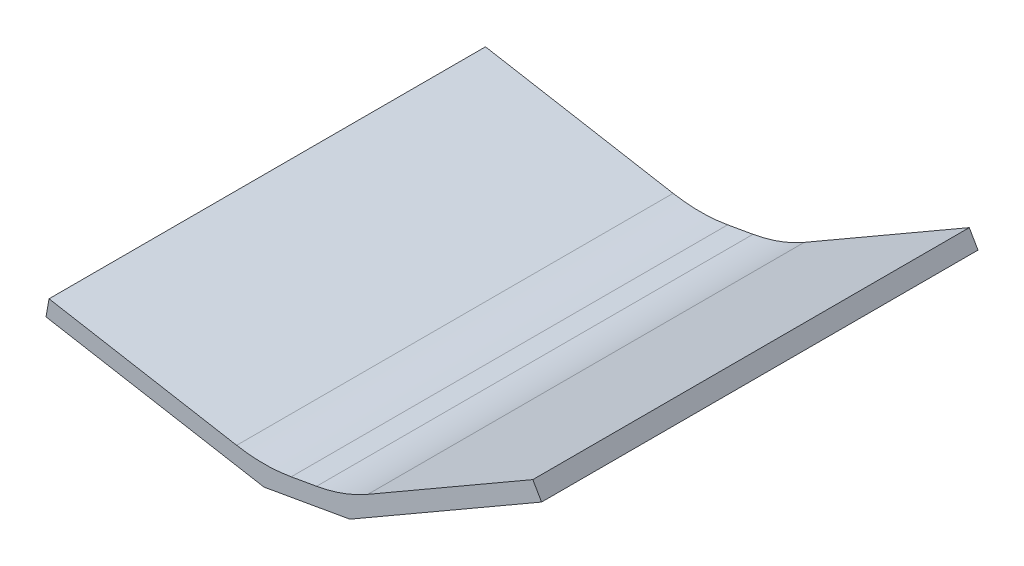
ISO-10303-21;
HEADER;
FILE_DESCRIPTION(('STEP AP214'),'2;1');
FILE_NAME('part.step','',(''),(''),'','','');
FILE_SCHEMA(('AUTOMOTIVE_DESIGN { 1 0 10303 214 1 1 1 1 }'));
ENDSEC;
DATA;
#1=APPLICATION_CONTEXT('core data for automotive mechanical design processes');
#2=APPLICATION_PROTOCOL_DEFINITION('international standard','automotive_design',2000,#1);
#3=PRODUCT_CONTEXT('',#1,'mechanical');
#4=PRODUCT('Part','Part','',(#3));
#5=PRODUCT_RELATED_PRODUCT_CATEGORY('part','',(#4));
#6=PRODUCT_DEFINITION_FORMATION('','',#4);
#7=PRODUCT_DEFINITION_CONTEXT('part definition',#1,'design');
#8=PRODUCT_DEFINITION('design','',#6,#7);
#9=PRODUCT_DEFINITION_SHAPE('','',#8);
#10=(LENGTH_UNIT() NAMED_UNIT(*) SI_UNIT(.MILLI.,.METRE.));
#11=(NAMED_UNIT(*) PLANE_ANGLE_UNIT() SI_UNIT($,.RADIAN.));
#12=(NAMED_UNIT(*) SI_UNIT($,.STERADIAN.) SOLID_ANGLE_UNIT());
#13=UNCERTAINTY_MEASURE_WITH_UNIT(LENGTH_MEASURE(1.E-05),#10,'distance_accuracy_value','');
#14=(GEOMETRIC_REPRESENTATION_CONTEXT(3) GLOBAL_UNCERTAINTY_ASSIGNED_CONTEXT((#13)) GLOBAL_UNIT_ASSIGNED_CONTEXT((#10,
#11,#12)) REPRESENTATION_CONTEXT('',''));
#15=CARTESIAN_POINT('',(0.,0.,0.));
#16=DIRECTION('',(0.,0.,1.));
#17=DIRECTION('',(1.,0.,0.));
#18=AXIS2_PLACEMENT_3D('',#15,#16,#17);
#19=CARTESIAN_POINT('',(-55.0824007371197,2.62066859807962,50.));
#20=DIRECTION('',(-0.173648177666929,-0.984807753012208,0.));
#21=DIRECTION('',(0.984807753012208,-0.173648177666929,0.));
#22=AXIS2_PLACEMENT_3D('',#19,#20,#21);
#23=PLANE('',#22);
#24=DIRECTION('',(-0.984807753012208,0.173648177666929,0.));
#25=VECTOR('',#24,1.);
#26=CARTESIAN_POINT('',(-55.0824007371197,2.62066859807962,50.));
#27=LINE('',#26,#25);
#28=CARTESIAN_POINT('',(-58.2080679351244,3.17180805780327,50.));
#29=VERTEX_POINT('',#28);
#30=CARTESIAN_POINT('',(-79.7025945624249,6.96187303975283,50.));
#31=VERTEX_POINT('',#30);
#32=EDGE_CURVE('E113',#29,#31,#27,.T.);
#33=ORIENTED_EDGE('',*,*,#32,.F.);
#34=DIRECTION('',(0.,0.,-1.));
#35=VECTOR('',#34,1.);
#36=CARTESIAN_POINT('',(-58.2080679351244,3.17180805780327,50.));
#37=LINE('',#36,#35);
#38=CARTESIAN_POINT('',(-58.2080679351244,3.17180805780327,0.));
#39=VERTEX_POINT('',#38);
#40=EDGE_CURVE('E137',#29,#39,#37,.T.);
#41=ORIENTED_EDGE('',*,*,#40,.T.);
#42=DIRECTION('',(-0.984807753012208,0.173648177666929,0.));
#43=VECTOR('',#42,1.);
#44=CARTESIAN_POINT('',(-55.0824007371197,2.62066859807962,0.));
#45=LINE('',#44,#43);
#46=CARTESIAN_POINT('',(-79.7025945624249,6.96187303975283,0.));
#47=VERTEX_POINT('',#46);
#48=EDGE_CURVE('E140',#39,#47,#45,.T.);
#49=ORIENTED_EDGE('',*,*,#48,.T.);
#50=DIRECTION('',(0.,0.,-1.));
#51=VECTOR('',#50,1.);
#52=CARTESIAN_POINT('',(-79.7025945624249,6.96187303975283,50.));
#53=LINE('',#52,#51);
#54=EDGE_CURVE('E128',#31,#47,#53,.T.);
#55=ORIENTED_EDGE('',*,*,#54,.F.);
#56=EDGE_LOOP('',(#33,#41,#49,#55));
#57=FACE_BOUND('',#56,.T.);
#58=ADVANCED_FACE('F39',(#57),#23,.F.);
#59=CARTESIAN_POINT('',(-79.7025945624249,6.96187303975283,50.));
#60=DIRECTION('',(0.984807753012207,-0.173648177666935,0.));
#61=DIRECTION('',(0.173648177666935,0.984807753012207,0.));
#62=AXIS2_PLACEMENT_3D('',#59,#60,#61);
#63=PLANE('',#62);
#64=DIRECTION('',(-0.173648177666935,-0.984807753012207,0.));
#65=VECTOR('',#64,1.);
#66=CARTESIAN_POINT('',(-79.7025945624249,6.96187303975283,0.));
#67=LINE('',#66,#65);
#68=CARTESIAN_POINT('',(-80.0498909177588,4.99225753372842,0.));
#69=VERTEX_POINT('',#68);
#70=EDGE_CURVE('E288',#47,#69,#67,.T.);
#71=ORIENTED_EDGE('',*,*,#70,.T.);
#72=DIRECTION('',(0.,0.,-1.));
#73=VECTOR('',#72,1.);
#74=CARTESIAN_POINT('',(-80.0498909177588,4.99225753372842,50.));
#75=LINE('',#74,#73);
#76=CARTESIAN_POINT('',(-80.0498909177588,4.99225753372842,50.));
#77=VERTEX_POINT('',#76);
#78=EDGE_CURVE('E132',#77,#69,#75,.T.);
#79=ORIENTED_EDGE('',*,*,#78,.F.);
#80=DIRECTION('',(-0.173648177666935,-0.984807753012207,0.));
#81=VECTOR('',#80,1.);
#82=CARTESIAN_POINT('',(-79.7025945624249,6.96187303975283,50.));
#83=LINE('',#82,#81);
#84=EDGE_CURVE('E120',#31,#77,#83,.T.);
#85=ORIENTED_EDGE('',*,*,#84,.F.);
#86=ORIENTED_EDGE('',*,*,#54,.T.);
#87=EDGE_LOOP('',(#71,#79,#85,#86));
#88=FACE_BOUND('',#87,.T.);
#89=ADVANCED_FACE('F126',(#88),#63,.F.);
#90=CARTESIAN_POINT('',(-80.0498909177588,4.99225753372842,50.));
#91=DIRECTION('',(0.173648177666928,0.984807753012208,0.));
#92=DIRECTION('',(-0.984807753012208,0.173648177666928,0.));
#93=AXIS2_PLACEMENT_3D('',#90,#91,#92);
#94=PLANE('',#93);
#95=DIRECTION('',(0.984807753012208,-0.173648177666928,0.));
#96=VECTOR('',#95,1.);
#97=CARTESIAN_POINT('',(-80.0498909177588,4.99225753372842,0.));
#98=LINE('',#97,#96);
#99=CARTESIAN_POINT('',(-55.0824007371197,0.589815374308132,0.));
#100=VERTEX_POINT('',#99);
#101=EDGE_CURVE('E289',#69,#100,#98,.T.);
#102=ORIENTED_EDGE('',*,*,#101,.T.);
#103=DIRECTION('',(0.,0.,-1.));
#104=VECTOR('',#103,1.);
#105=CARTESIAN_POINT('',(-55.0824007371197,0.589815374308132,50.));
#106=LINE('',#105,#104);
#107=CARTESIAN_POINT('',(-55.0824007371197,0.589815374308132,50.));
#108=VERTEX_POINT('',#107);
#109=EDGE_CURVE('E141',#108,#100,#106,.T.);
#110=ORIENTED_EDGE('',*,*,#109,.F.);
#111=DIRECTION('',(0.984807753012208,-0.173648177666928,0.));
#112=VECTOR('',#111,1.);
#113=CARTESIAN_POINT('',(-80.0498909177588,4.99225753372842,50.));
#114=LINE('',#113,#112);
#115=EDGE_CURVE('E133',#77,#108,#114,.T.);
#116=ORIENTED_EDGE('',*,*,#115,.F.);
#117=ORIENTED_EDGE('',*,*,#78,.T.);
#118=EDGE_LOOP('',(#102,#110,#116,#117));
#119=FACE_BOUND('',#118,.T.);
#120=ADVANCED_FACE('F177',(#119),#94,.F.);
#121=CARTESIAN_POINT('',(-55.0824007371197,0.589815374308132,50.));
#122=DIRECTION('',(-0.173648177666927,0.984807753012209,0.));
#123=DIRECTION('',(-0.984807753012209,-0.173648177666927,0.));
#124=AXIS2_PLACEMENT_3D('',#121,#122,#123);
#125=PLANE('',#124);
#126=DIRECTION('',(0.984807753012209,0.173648177666927,0.));
#127=VECTOR('',#126,1.);
#128=CARTESIAN_POINT('',(-55.0824007371197,0.589815374308132,0.));
#129=LINE('',#128,#127);
#130=CARTESIAN_POINT('',(-45.2343232069977,2.3262971509774,0.));
#131=VERTEX_POINT('',#130);
#132=EDGE_CURVE('E292',#100,#131,#129,.T.);
#133=ORIENTED_EDGE('',*,*,#132,.T.);
#134=DIRECTION('',(0.,0.,-1.));
#135=VECTOR('',#134,1.);
#136=CARTESIAN_POINT('',(-45.2343232069977,2.3262971509774,50.));
#137=LINE('',#136,#135);
#138=CARTESIAN_POINT('',(-45.2343232069977,2.3262971509774,50.));
#139=VERTEX_POINT('',#138);
#140=EDGE_CURVE('E297',#139,#131,#137,.T.);
#141=ORIENTED_EDGE('',*,*,#140,.F.);
#142=DIRECTION('',(0.984807753012209,0.173648177666927,0.));
#143=VECTOR('',#142,1.);
#144=CARTESIAN_POINT('',(-55.0824007371197,0.589815374308132,50.));
#145=LINE('',#144,#143);
#146=EDGE_CURVE('E306',#108,#139,#145,.T.);
#147=ORIENTED_EDGE('',*,*,#146,.F.);
#148=ORIENTED_EDGE('',*,*,#109,.T.);
#149=EDGE_LOOP('',(#133,#141,#147,#148));
#150=FACE_BOUND('',#149,.T.);
#151=ADVANCED_FACE('F183',(#150),#125,.F.);
#152=CARTESIAN_POINT('',(-23.2782808230544,15.0026241316858,50.));
#153=DIRECTION('',(0.499999999999998,-0.86602540378444,0.));
#154=DIRECTION('',(0.86602540378444,0.499999999999998,0.));
#155=AXIS2_PLACEMENT_3D('',#152,#153,#154);
#156=PLANE('',#155);
#157=DIRECTION('',(-0.86602540378444,-0.499999999999998,0.));
#158=VECTOR('',#157,1.);
#159=CARTESIAN_POINT('',(-23.2782808230544,15.0026241316858,0.));
#160=LINE('',#159,#158);
#161=CARTESIAN_POINT('',(-23.2782808230544,15.0026241316858,0.));
#162=VERTEX_POINT('',#161);
#163=EDGE_CURVE('E294',#162,#131,#160,.T.);
#164=ORIENTED_EDGE('',*,*,#163,.F.);
#165=DIRECTION('',(0.,0.,-1.));
#166=VECTOR('',#165,1.);
#167=CARTESIAN_POINT('',(-23.2782808230544,15.0026241316858,50.));
#168=LINE('',#167,#166);
#169=CARTESIAN_POINT('',(-23.2782808230544,15.0026241316858,50.));
#170=VERTEX_POINT('',#169);
#171=EDGE_CURVE('E281',#170,#162,#168,.T.);
#172=ORIENTED_EDGE('',*,*,#171,.F.);
#173=DIRECTION('',(-0.86602540378444,-0.499999999999998,0.));
#174=VECTOR('',#173,1.);
#175=CARTESIAN_POINT('',(-23.2782808230544,15.0026241316858,50.));
#176=LINE('',#175,#174);
#177=EDGE_CURVE('E311',#170,#139,#176,.T.);
#178=ORIENTED_EDGE('',*,*,#177,.T.);
#179=ORIENTED_EDGE('',*,*,#140,.T.);
#180=EDGE_LOOP('',(#164,#172,#178,#179));
#181=FACE_BOUND('',#180,.T.);
#182=ADVANCED_FACE('F189',(#181),#156,.T.);
#183=CARTESIAN_POINT('',(-24.2782808230544,16.7346749392547,50.));
#184=DIRECTION('',(0.866025403784438,0.500000000000002,0.));
#185=DIRECTION('',(-0.500000000000002,0.866025403784438,0.));
#186=AXIS2_PLACEMENT_3D('',#183,#184,#185);
#187=PLANE('',#186);
#188=DIRECTION('',(0.500000000000002,-0.866025403784438,0.));
#189=VECTOR('',#188,1.);
#190=CARTESIAN_POINT('',(-24.2782808230544,16.7346749392547,0.));
#191=LINE('',#190,#189);
#192=CARTESIAN_POINT('',(-24.2782808230544,16.7346749392547,0.));
#193=VERTEX_POINT('',#192);
#194=EDGE_CURVE('E274',#193,#162,#191,.T.);
#195=ORIENTED_EDGE('',*,*,#194,.F.);
#196=DIRECTION('',(0.,0.,-1.));
#197=VECTOR('',#196,1.);
#198=CARTESIAN_POINT('',(-24.2782808230544,16.7346749392547,50.));
#199=LINE('',#198,#197);
#200=CARTESIAN_POINT('',(-24.2782808230544,16.7346749392547,50.));
#201=VERTEX_POINT('',#200);
#202=EDGE_CURVE('E272',#201,#193,#199,.T.);
#203=ORIENTED_EDGE('',*,*,#202,.F.);
#204=DIRECTION('',(0.500000000000002,-0.866025403784438,0.));
#205=VECTOR('',#204,1.);
#206=CARTESIAN_POINT('',(-24.2782808230544,16.7346749392547,50.));
#207=LINE('',#206,#205);
#208=EDGE_CURVE('E284',#201,#170,#207,.T.);
#209=ORIENTED_EDGE('',*,*,#208,.T.);
#210=ORIENTED_EDGE('',*,*,#171,.T.);
#211=EDGE_LOOP('',(#195,#203,#209,#210));
#212=FACE_BOUND('',#211,.T.);
#213=ADVANCED_FACE('F195',(#212),#187,.T.);
#214=CARTESIAN_POINT('',(-45.9289159176654,4.23467493925474,50.));
#215=DIRECTION('',(-0.499999999999998,0.86602540378444,0.));
#216=DIRECTION('',(-0.86602540378444,-0.499999999999998,0.));
#217=AXIS2_PLACEMENT_3D('',#214,#215,#216);
#218=PLANE('',#217);
#219=DIRECTION('',(0.86602540378444,0.499999999999998,0.));
#220=VECTOR('',#219,1.);
#221=CARTESIAN_POINT('',(-45.9289159176654,4.23467493925474,0.));
#222=LINE('',#221,#220);
#223=CARTESIAN_POINT('',(-43.1802503136748,5.82161776563093,0.));
#224=VERTEX_POINT('',#223);
#225=EDGE_CURVE('E162',#224,#193,#222,.T.);
#226=ORIENTED_EDGE('',*,*,#225,.F.);
#227=DIRECTION('',(0.,0.,-1.));
#228=VECTOR('',#227,1.);
#229=CARTESIAN_POINT('',(-43.1802503136748,5.82161776563093,50.));
#230=LINE('',#229,#228);
#231=CARTESIAN_POINT('',(-43.1802503136748,5.82161776563093,50.));
#232=VERTEX_POINT('',#231);
#233=EDGE_CURVE('E53',#224,#232,#230,.F.);
#234=ORIENTED_EDGE('',*,*,#233,.T.);
#235=DIRECTION('',(0.86602540378444,0.499999999999998,0.));
#236=VECTOR('',#235,1.);
#237=CARTESIAN_POINT('',(-45.9289159176654,4.23467493925474,50.));
#238=LINE('',#237,#236);
#239=EDGE_CURVE('E276',#232,#201,#238,.T.);
#240=ORIENTED_EDGE('',*,*,#239,.T.);
#241=ORIENTED_EDGE('',*,*,#202,.T.);
#242=EDGE_LOOP('',(#226,#234,#240,#241));
#243=FACE_BOUND('',#242,.T.);
#244=ADVANCED_FACE('F193',(#243),#218,.T.);
#245=CARTESIAN_POINT('',(-55.0824007371197,2.62066859807962,50.));
#246=DIRECTION('',(-0.173648177666927,0.984807753012209,0.));
#247=DIRECTION('',(-0.984807753012209,-0.173648177666927,0.));
#248=AXIS2_PLACEMENT_3D('',#245,#246,#247);
#249=PLANE('',#248);
#250=DIRECTION('',(0.984807753012209,0.173648177666927,0.));
#251=VECTOR('',#250,1.);
#252=CARTESIAN_POINT('',(-55.0824007371197,2.62066859807962,0.));
#253=LINE('',#252,#251);
#254=CARTESIAN_POINT('',(-51.956733539115,3.17180805780326,0.));
#255=VERTEX_POINT('',#254);
#256=CARTESIAN_POINT('',(-49.0545831156701,3.68353547953109,0.));
#257=VERTEX_POINT('',#256);
#258=EDGE_CURVE('E123',#255,#257,#253,.T.);
#259=ORIENTED_EDGE('',*,*,#258,.F.);
#260=DIRECTION('',(0.,0.,-1.));
#261=VECTOR('',#260,1.);
#262=CARTESIAN_POINT('',(-51.956733539115,3.17180805780326,50.));
#263=LINE('',#262,#261);
#264=CARTESIAN_POINT('',(-51.956733539115,3.17180805780326,50.));
#265=VERTEX_POINT('',#264);
#266=EDGE_CURVE('E146',#255,#265,#263,.F.);
#267=ORIENTED_EDGE('',*,*,#266,.T.);
#268=DIRECTION('',(0.984807753012209,0.173648177666927,0.));
#269=VECTOR('',#268,1.);
#270=CARTESIAN_POINT('',(-55.0824007371197,2.62066859807962,50.));
#271=LINE('',#270,#269);
#272=CARTESIAN_POINT('',(-49.0545831156701,3.68353547953109,50.));
#273=VERTEX_POINT('',#272);
#274=EDGE_CURVE('E280',#265,#273,#271,.T.);
#275=ORIENTED_EDGE('',*,*,#274,.T.);
#276=DIRECTION('',(0.,0.,-1.));
#277=VECTOR('',#276,1.);
#278=CARTESIAN_POINT('',(-49.0545831156701,3.68353547953108,0.));
#279=LINE('',#278,#277);
#280=EDGE_CURVE('E142',#273,#257,#279,.T.);
#281=ORIENTED_EDGE('',*,*,#280,.T.);
#282=EDGE_LOOP('',(#259,#267,#275,#281));
#283=FACE_BOUND('',#282,.T.);
#284=ADVANCED_FACE('F157',(#283),#249,.T.);
#285=CARTESIAN_POINT('',(0.,0.,50.));
#286=DIRECTION('',(0.,0.,1.));
#287=DIRECTION('',(1.,0.,0.));
#288=AXIS2_PLACEMENT_3D('',#285,#286,#287);
#289=PLANE('',#288);
#290=ORIENTED_EDGE('',*,*,#274,.F.);
#291=CARTESIAN_POINT('',(-55.0824007371197,20.898347612023,50.));
#292=DIRECTION('',(0.,0.,1.));
#293=DIRECTION('',(1.,0.,0.));
#294=AXIS2_PLACEMENT_3D('',#291,#292,#293);
#295=CIRCLE('',#294,18.);
#296=EDGE_CURVE('E119',#265,#29,#295,.F.);
#297=ORIENTED_EDGE('',*,*,#296,.T.);
#298=ORIENTED_EDGE('',*,*,#32,.T.);
#299=ORIENTED_EDGE('',*,*,#84,.T.);
#300=ORIENTED_EDGE('',*,*,#115,.T.);
#301=ORIENTED_EDGE('',*,*,#146,.T.);
#302=ORIENTED_EDGE('',*,*,#177,.F.);
#303=ORIENTED_EDGE('',*,*,#208,.F.);
#304=ORIENTED_EDGE('',*,*,#239,.F.);
#305=CARTESIAN_POINT('',(-52.1802503136748,21.4100750337508,50.));
#306=DIRECTION('',(0.,0.,1.));
#307=DIRECTION('',(1.,0.,0.));
#308=AXIS2_PLACEMENT_3D('',#305,#306,#307);
#309=CIRCLE('',#308,18.);
#310=EDGE_CURVE('E11',#232,#273,#309,.F.);
#311=ORIENTED_EDGE('',*,*,#310,.T.);
#312=EDGE_LOOP('',(#290,#297,#298,#299,#300,#301,#302,#303,#304,#311));
#313=FACE_BOUND('',#312,.T.);
#314=ADVANCED_FACE('F116',(#313),#289,.T.);
#315=CARTESIAN_POINT('',(0.,0.,0.));
#316=DIRECTION('',(0.,0.,1.));
#317=DIRECTION('',(1.,0.,0.));
#318=AXIS2_PLACEMENT_3D('',#315,#316,#317);
#319=PLANE('',#318);
#320=ORIENTED_EDGE('',*,*,#48,.F.);
#321=CARTESIAN_POINT('',(-55.0824007371197,20.898347612023,0.));
#322=DIRECTION('',(0.,0.,1.));
#323=DIRECTION('',(1.,0.,0.));
#324=AXIS2_PLACEMENT_3D('',#321,#322,#323);
#325=CIRCLE('',#324,18.);
#326=EDGE_CURVE('E152',#39,#255,#325,.T.);
#327=ORIENTED_EDGE('',*,*,#326,.T.);
#328=ORIENTED_EDGE('',*,*,#258,.T.);
#329=CARTESIAN_POINT('',(-52.1802503136748,21.4100750337508,0.));
#330=DIRECTION('',(0.,0.,1.));
#331=DIRECTION('',(1.,0.,0.));
#332=AXIS2_PLACEMENT_3D('',#329,#330,#331);
#333=CIRCLE('',#332,18.);
#334=EDGE_CURVE('E50',#257,#224,#333,.T.);
#335=ORIENTED_EDGE('',*,*,#334,.T.);
#336=ORIENTED_EDGE('',*,*,#225,.T.);
#337=ORIENTED_EDGE('',*,*,#194,.T.);
#338=ORIENTED_EDGE('',*,*,#163,.T.);
#339=ORIENTED_EDGE('',*,*,#132,.F.);
#340=ORIENTED_EDGE('',*,*,#101,.F.);
#341=ORIENTED_EDGE('',*,*,#70,.F.);
#342=EDGE_LOOP('',(#320,#327,#328,#335,#336,#337,#338,#339,#340,#341));
#343=FACE_BOUND('',#342,.T.);
#344=ADVANCED_FACE('F155',(#343),#319,.F.);
#345=CARTESIAN_POINT('',(-55.0824007371197,20.898347612023,50.));
#346=DIRECTION('',(0.,0.,-1.));
#347=DIRECTION('',(-1.,0.,0.));
#348=AXIS2_PLACEMENT_3D('',#345,#346,#347);
#349=CYLINDRICAL_SURFACE('',#348,18.);
#350=ORIENTED_EDGE('',*,*,#296,.F.);
#351=ORIENTED_EDGE('',*,*,#266,.F.);
#352=ORIENTED_EDGE('',*,*,#326,.F.);
#353=ORIENTED_EDGE('',*,*,#40,.F.);
#354=EDGE_LOOP('',(#350,#351,#352,#353));
#355=FACE_BOUND('',#354,.T.);
#356=ADVANCED_FACE('F165',(#355),#349,.F.);
#357=CARTESIAN_POINT('',(-52.1802503136748,21.4100750337508,50.));
#358=DIRECTION('',(0.,0.,1.));
#359=DIRECTION('',(1.,0.,0.));
#360=AXIS2_PLACEMENT_3D('',#357,#358,#359);
#361=CYLINDRICAL_SURFACE('',#360,18.);
#362=ORIENTED_EDGE('',*,*,#310,.F.);
#363=ORIENTED_EDGE('',*,*,#233,.F.);
#364=ORIENTED_EDGE('',*,*,#334,.F.);
#365=ORIENTED_EDGE('',*,*,#280,.F.);
#366=EDGE_LOOP('',(#362,#363,#364,#365));
#367=FACE_BOUND('',#366,.T.);
#368=ADVANCED_FACE('F41',(#367),#361,.F.);
#369=CLOSED_SHELL('',(#58,#89,#120,#151,#182,#213,#244,#284,#314,#344,#356,#368));
#370=MANIFOLD_SOLID_BREP('B2',#369);
#371=ADVANCED_BREP_SHAPE_REPRESENTATION('',(#18,#370),#14);
#372=SHAPE_DEFINITION_REPRESENTATION(#9,#371);
ENDSEC;
END-ISO-10303-21;
